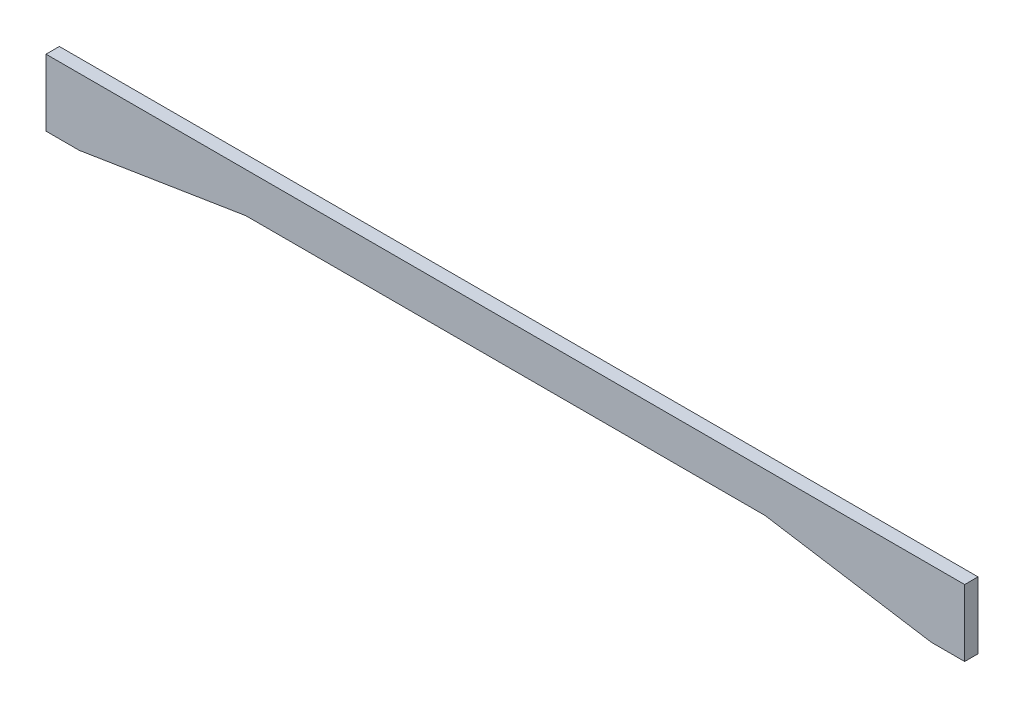
ISO-10303-21;
HEADER;
FILE_DESCRIPTION(('STEP AP214'),'2;1');
FILE_NAME('part.step','',(''),(''),'','','');
FILE_SCHEMA(('AUTOMOTIVE_DESIGN { 1 0 10303 214 1 1 1 1 }'));
ENDSEC;
DATA;
#1=APPLICATION_CONTEXT('core data for automotive mechanical design processes');
#2=APPLICATION_PROTOCOL_DEFINITION('international standard','automotive_design',2000,#1);
#3=PRODUCT_CONTEXT('',#1,'mechanical');
#4=PRODUCT('Part','Part','',(#3));
#5=PRODUCT_RELATED_PRODUCT_CATEGORY('part','',(#4));
#6=PRODUCT_DEFINITION_FORMATION('','',#4);
#7=PRODUCT_DEFINITION_CONTEXT('part definition',#1,'design');
#8=PRODUCT_DEFINITION('design','',#6,#7);
#9=PRODUCT_DEFINITION_SHAPE('','',#8);
#10=(LENGTH_UNIT() NAMED_UNIT(*) SI_UNIT(.MILLI.,.METRE.));
#11=(NAMED_UNIT(*) PLANE_ANGLE_UNIT() SI_UNIT($,.RADIAN.));
#12=(NAMED_UNIT(*) SI_UNIT($,.STERADIAN.) SOLID_ANGLE_UNIT());
#13=UNCERTAINTY_MEASURE_WITH_UNIT(LENGTH_MEASURE(1.E-05),#10,'distance_accuracy_value','');
#14=(GEOMETRIC_REPRESENTATION_CONTEXT(3) GLOBAL_UNCERTAINTY_ASSIGNED_CONTEXT((#13)) GLOBAL_UNIT_ASSIGNED_CONTEXT((#10,
#11,#12)) REPRESENTATION_CONTEXT('',''));
#15=CARTESIAN_POINT('',(0.,0.,0.));
#16=DIRECTION('',(0.,0.,1.));
#17=DIRECTION('',(1.,0.,0.));
#18=AXIS2_PLACEMENT_3D('',#15,#16,#17);
#19=CARTESIAN_POINT('',(0.,-8.,4.));
#20=DIRECTION('',(0.,1.,0.));
#21=DIRECTION('',(0.,0.,1.));
#22=AXIS2_PLACEMENT_3D('',#19,#20,#21);
#23=PLANE('',#22);
#24=DIRECTION('',(1.,0.,0.));
#25=VECTOR('',#24,1.);
#26=CARTESIAN_POINT('',(0.,-8.,0.));
#27=LINE('',#26,#25);
#28=CARTESIAN_POINT('',(-137.75,-8.,0.));
#29=VERTEX_POINT('',#28);
#30=CARTESIAN_POINT('',(-127.75,-8.,0.));
#31=VERTEX_POINT('',#30);
#32=EDGE_CURVE('E116',#29,#31,#27,.T.);
#33=ORIENTED_EDGE('',*,*,#32,.T.);
#34=DIRECTION('',(0.,0.,-1.));
#35=VECTOR('',#34,1.);
#36=CARTESIAN_POINT('',(-127.75,-8.,4.));
#37=LINE('',#36,#35);
#38=CARTESIAN_POINT('',(-127.75,-8.,4.));
#39=VERTEX_POINT('',#38);
#40=EDGE_CURVE('E11',#39,#31,#37,.T.);
#41=ORIENTED_EDGE('',*,*,#40,.F.);
#42=DIRECTION('',(1.,0.,0.));
#43=VECTOR('',#42,1.);
#44=CARTESIAN_POINT('',(0.,-8.,4.));
#45=LINE('',#44,#43);
#46=CARTESIAN_POINT('',(-137.75,-8.,4.));
#47=VERTEX_POINT('',#46);
#48=EDGE_CURVE('E145',#47,#39,#45,.T.);
#49=ORIENTED_EDGE('',*,*,#48,.F.);
#50=DIRECTION('',(0.,0.,-1.));
#51=VECTOR('',#50,1.);
#52=CARTESIAN_POINT('',(-137.75,-8.,4.));
#53=LINE('',#52,#51);
#54=EDGE_CURVE('E51',#47,#29,#53,.T.);
#55=ORIENTED_EDGE('',*,*,#54,.T.);
#56=EDGE_LOOP('',(#33,#41,#49,#55));
#57=FACE_BOUND('',#56,.T.);
#58=ADVANCED_FACE('F35',(#57),#23,.F.);
#59=CARTESIAN_POINT('',(-1.95103976814719,12.1690684395828,4.));
#60=DIRECTION('',(-0.158306064425804,0.98739009006877,0.));
#61=DIRECTION('',(-0.98739009006877,-0.158306064425804,0.));
#62=AXIS2_PLACEMENT_3D('',#59,#60,#61);
#63=PLANE('',#62);
#64=DIRECTION('',(0.98739009006877,0.158306064425804,0.));
#65=VECTOR('',#64,1.);
#66=CARTESIAN_POINT('',(-1.95103976814719,12.1690684395828,0.));
#67=LINE('',#66,#65);
#68=CARTESIAN_POINT('',(-77.8522228731333,0.,0.));
#69=VERTEX_POINT('',#68);
#70=EDGE_CURVE('E157',#31,#69,#67,.T.);
#71=ORIENTED_EDGE('',*,*,#70,.T.);
#72=DIRECTION('',(0.,0.,-1.));
#73=VECTOR('',#72,1.);
#74=CARTESIAN_POINT('',(-77.8522228731333,0.,4.));
#75=LINE('',#74,#73);
#76=CARTESIAN_POINT('',(-77.8522228731333,0.,4.));
#77=VERTEX_POINT('',#76);
#78=EDGE_CURVE('E43',#77,#69,#75,.T.);
#79=ORIENTED_EDGE('',*,*,#78,.F.);
#80=DIRECTION('',(0.98739009006877,0.158306064425804,0.));
#81=VECTOR('',#80,1.);
#82=CARTESIAN_POINT('',(-1.95103976814719,12.1690684395828,4.));
#83=LINE('',#82,#81);
#84=EDGE_CURVE('E77',#39,#77,#83,.T.);
#85=ORIENTED_EDGE('',*,*,#84,.F.);
#86=ORIENTED_EDGE('',*,*,#40,.T.);
#87=EDGE_LOOP('',(#71,#79,#85,#86));
#88=FACE_BOUND('',#87,.T.);
#89=ADVANCED_FACE('F171',(#88),#63,.F.);
#90=CARTESIAN_POINT('',(0.,0.,4.));
#91=DIRECTION('',(0.,-1.,0.));
#92=DIRECTION('',(0.,0.,-1.));
#93=AXIS2_PLACEMENT_3D('',#90,#91,#92);
#94=PLANE('',#93);
#95=DIRECTION('',(-1.,0.,0.));
#96=VECTOR('',#95,1.);
#97=CARTESIAN_POINT('',(0.,0.,0.));
#98=LINE('',#97,#96);
#99=CARTESIAN_POINT('',(77.8522228731333,0.,0.));
#100=VERTEX_POINT('',#99);
#101=EDGE_CURVE('E160',#100,#69,#98,.T.);
#102=ORIENTED_EDGE('',*,*,#101,.F.);
#103=DIRECTION('',(0.,0.,-1.));
#104=VECTOR('',#103,1.);
#105=CARTESIAN_POINT('',(77.8522228731333,0.,4.));
#106=LINE('',#105,#104);
#107=CARTESIAN_POINT('',(77.8522228731333,0.,4.));
#108=VERTEX_POINT('',#107);
#109=EDGE_CURVE('E141',#108,#100,#106,.T.);
#110=ORIENTED_EDGE('',*,*,#109,.F.);
#111=DIRECTION('',(-1.,0.,0.));
#112=VECTOR('',#111,1.);
#113=CARTESIAN_POINT('',(0.,0.,4.));
#114=LINE('',#113,#112);
#115=EDGE_CURVE('E149',#108,#77,#114,.T.);
#116=ORIENTED_EDGE('',*,*,#115,.T.);
#117=ORIENTED_EDGE('',*,*,#78,.T.);
#118=EDGE_LOOP('',(#102,#110,#116,#117));
#119=FACE_BOUND('',#118,.T.);
#120=ADVANCED_FACE('F169',(#119),#94,.T.);
#121=CARTESIAN_POINT('',(0.,12.,4.));
#122=DIRECTION('',(0.,1.,0.));
#123=DIRECTION('',(0.,0.,1.));
#124=AXIS2_PLACEMENT_3D('',#121,#122,#123);
#125=PLANE('',#124);
#126=DIRECTION('',(1.,0.,0.));
#127=VECTOR('',#126,1.);
#128=CARTESIAN_POINT('',(0.,12.,0.));
#129=LINE('',#128,#127);
#130=CARTESIAN_POINT('',(-137.75,12.,0.));
#131=VERTEX_POINT('',#130);
#132=CARTESIAN_POINT('',(137.75,12.,0.));
#133=VERTEX_POINT('',#132);
#134=EDGE_CURVE('E163',#131,#133,#129,.T.);
#135=ORIENTED_EDGE('',*,*,#134,.F.);
#136=DIRECTION('',(0.,0.,-1.));
#137=VECTOR('',#136,1.);
#138=CARTESIAN_POINT('',(-137.75,12.,4.));
#139=LINE('',#138,#137);
#140=CARTESIAN_POINT('',(-137.75,12.,4.));
#141=VERTEX_POINT('',#140);
#142=EDGE_CURVE('E66',#141,#131,#139,.T.);
#143=ORIENTED_EDGE('',*,*,#142,.F.);
#144=DIRECTION('',(1.,0.,0.));
#145=VECTOR('',#144,1.);
#146=CARTESIAN_POINT('',(0.,12.,4.));
#147=LINE('',#146,#145);
#148=CARTESIAN_POINT('',(137.75,12.,4.));
#149=VERTEX_POINT('',#148);
#150=EDGE_CURVE('E152',#141,#149,#147,.T.);
#151=ORIENTED_EDGE('',*,*,#150,.T.);
#152=DIRECTION('',(0.,0.,-1.));
#153=VECTOR('',#152,1.);
#154=CARTESIAN_POINT('',(137.75,12.,4.));
#155=LINE('',#154,#153);
#156=EDGE_CURVE('E117',#149,#133,#155,.T.);
#157=ORIENTED_EDGE('',*,*,#156,.T.);
#158=EDGE_LOOP('',(#135,#143,#151,#157));
#159=FACE_BOUND('',#158,.T.);
#160=ADVANCED_FACE('F190',(#159),#125,.T.);
#161=CARTESIAN_POINT('',(-137.75,0.,4.));
#162=DIRECTION('',(-1.,0.,0.));
#163=DIRECTION('',(0.,0.,1.));
#164=AXIS2_PLACEMENT_3D('',#161,#162,#163);
#165=PLANE('',#164);
#166=DIRECTION('',(0.,1.,0.));
#167=VECTOR('',#166,1.);
#168=CARTESIAN_POINT('',(-137.75,0.,0.));
#169=LINE('',#168,#167);
#170=EDGE_CURVE('E147',#29,#131,#169,.T.);
#171=ORIENTED_EDGE('',*,*,#170,.F.);
#172=ORIENTED_EDGE('',*,*,#54,.F.);
#173=DIRECTION('',(0.,1.,0.));
#174=VECTOR('',#173,1.);
#175=CARTESIAN_POINT('',(-137.75,0.,4.));
#176=LINE('',#175,#174);
#177=EDGE_CURVE('E154',#47,#141,#176,.T.);
#178=ORIENTED_EDGE('',*,*,#177,.T.);
#179=ORIENTED_EDGE('',*,*,#142,.T.);
#180=EDGE_LOOP('',(#171,#172,#178,#179));
#181=FACE_BOUND('',#180,.T.);
#182=ADVANCED_FACE('F188',(#181),#165,.T.);
#183=CARTESIAN_POINT('',(0.,0.,4.));
#184=DIRECTION('',(0.,0.,1.));
#185=DIRECTION('',(1.,0.,0.));
#186=AXIS2_PLACEMENT_3D('',#183,#184,#185);
#187=PLANE('',#186);
#188=ORIENTED_EDGE('',*,*,#48,.T.);
#189=ORIENTED_EDGE('',*,*,#84,.T.);
#190=ORIENTED_EDGE('',*,*,#115,.F.);
#191=DIRECTION('',(-0.98739009006877,0.158306064425804,0.));
#192=VECTOR('',#191,1.);
#193=CARTESIAN_POINT('',(1.95103976814719,12.1690684395828,4.));
#194=LINE('',#193,#192);
#195=CARTESIAN_POINT('',(127.75,-7.99999999999999,4.));
#196=VERTEX_POINT('',#195);
#197=EDGE_CURVE('E126',#196,#108,#194,.T.);
#198=ORIENTED_EDGE('',*,*,#197,.F.);
#199=DIRECTION('',(-1.,0.,0.));
#200=VECTOR('',#199,1.);
#201=CARTESIAN_POINT('',(0.,-8.,4.));
#202=LINE('',#201,#200);
#203=CARTESIAN_POINT('',(137.75,-7.99999999999999,4.));
#204=VERTEX_POINT('',#203);
#205=EDGE_CURVE('E109',#204,#196,#202,.T.);
#206=ORIENTED_EDGE('',*,*,#205,.F.);
#207=DIRECTION('',(0.,1.,0.));
#208=VECTOR('',#207,1.);
#209=CARTESIAN_POINT('',(137.75,0.,4.));
#210=LINE('',#209,#208);
#211=EDGE_CURVE('E121',#204,#149,#210,.T.);
#212=ORIENTED_EDGE('',*,*,#211,.T.);
#213=ORIENTED_EDGE('',*,*,#150,.F.);
#214=ORIENTED_EDGE('',*,*,#177,.F.);
#215=EDGE_LOOP('',(#188,#189,#190,#198,#206,#212,#213,#214));
#216=FACE_BOUND('',#215,.T.);
#217=ADVANCED_FACE('F128',(#216),#187,.T.);
#218=CARTESIAN_POINT('',(0.,0.,0.));
#219=DIRECTION('',(0.,0.,1.));
#220=DIRECTION('',(1.,0.,0.));
#221=AXIS2_PLACEMENT_3D('',#218,#219,#220);
#222=PLANE('',#221);
#223=ORIENTED_EDGE('',*,*,#32,.F.);
#224=ORIENTED_EDGE('',*,*,#170,.T.);
#225=ORIENTED_EDGE('',*,*,#134,.T.);
#226=DIRECTION('',(0.,1.,0.));
#227=VECTOR('',#226,1.);
#228=CARTESIAN_POINT('',(137.75,0.,0.));
#229=LINE('',#228,#227);
#230=CARTESIAN_POINT('',(137.75,-7.99999999999999,0.));
#231=VERTEX_POINT('',#230);
#232=EDGE_CURVE('E133',#231,#133,#229,.T.);
#233=ORIENTED_EDGE('',*,*,#232,.F.);
#234=DIRECTION('',(-1.,0.,0.));
#235=VECTOR('',#234,1.);
#236=CARTESIAN_POINT('',(0.,-8.,0.));
#237=LINE('',#236,#235);
#238=CARTESIAN_POINT('',(127.75,-7.99999999999999,0.));
#239=VERTEX_POINT('',#238);
#240=EDGE_CURVE('E112',#231,#239,#237,.T.);
#241=ORIENTED_EDGE('',*,*,#240,.T.);
#242=DIRECTION('',(-0.98739009006877,0.158306064425804,0.));
#243=VECTOR('',#242,1.);
#244=CARTESIAN_POINT('',(1.95103976814719,12.1690684395828,0.));
#245=LINE('',#244,#243);
#246=EDGE_CURVE('E130',#239,#100,#245,.T.);
#247=ORIENTED_EDGE('',*,*,#246,.T.);
#248=ORIENTED_EDGE('',*,*,#101,.T.);
#249=ORIENTED_EDGE('',*,*,#70,.F.);
#250=EDGE_LOOP('',(#223,#224,#225,#233,#241,#247,#248,#249));
#251=FACE_BOUND('',#250,.T.);
#252=ADVANCED_FACE('F174',(#251),#222,.F.);
#253=CARTESIAN_POINT('',(0.,-8.,4.));
#254=DIRECTION('',(0.,-1.,0.));
#255=DIRECTION('',(1.,0.,0.));
#256=AXIS2_PLACEMENT_3D('',#253,#254,#255);
#257=PLANE('',#256);
#258=ORIENTED_EDGE('',*,*,#240,.F.);
#259=DIRECTION('',(0.,0.,-1.));
#260=VECTOR('',#259,1.);
#261=CARTESIAN_POINT('',(137.75,-7.99999999999999,4.));
#262=LINE('',#261,#260);
#263=EDGE_CURVE('E105',#204,#231,#262,.T.);
#264=ORIENTED_EDGE('',*,*,#263,.F.);
#265=ORIENTED_EDGE('',*,*,#205,.T.);
#266=DIRECTION('',(0.,0.,-1.));
#267=VECTOR('',#266,1.);
#268=CARTESIAN_POINT('',(127.75,-7.99999999999999,4.));
#269=LINE('',#268,#267);
#270=EDGE_CURVE('E137',#196,#239,#269,.T.);
#271=ORIENTED_EDGE('',*,*,#270,.T.);
#272=EDGE_LOOP('',(#258,#264,#265,#271));
#273=FACE_BOUND('',#272,.T.);
#274=ADVANCED_FACE('F107',(#273),#257,.T.);
#275=CARTESIAN_POINT('',(137.75,0.,4.));
#276=DIRECTION('',(-1.,0.,0.));
#277=DIRECTION('',(0.,-1.,0.));
#278=AXIS2_PLACEMENT_3D('',#275,#276,#277);
#279=PLANE('',#278);
#280=ORIENTED_EDGE('',*,*,#232,.T.);
#281=ORIENTED_EDGE('',*,*,#156,.F.);
#282=ORIENTED_EDGE('',*,*,#211,.F.);
#283=ORIENTED_EDGE('',*,*,#263,.T.);
#284=EDGE_LOOP('',(#280,#281,#282,#283));
#285=FACE_BOUND('',#284,.T.);
#286=ADVANCED_FACE('F122',(#285),#279,.F.);
#287=CARTESIAN_POINT('',(1.95103976814719,12.1690684395828,4.));
#288=DIRECTION('',(-0.158306064425804,-0.98739009006877,0.));
#289=DIRECTION('',(0.98739009006877,-0.158306064425804,0.));
#290=AXIS2_PLACEMENT_3D('',#287,#288,#289);
#291=PLANE('',#290);
#292=ORIENTED_EDGE('',*,*,#246,.F.);
#293=ORIENTED_EDGE('',*,*,#270,.F.);
#294=ORIENTED_EDGE('',*,*,#197,.T.);
#295=ORIENTED_EDGE('',*,*,#109,.T.);
#296=EDGE_LOOP('',(#292,#293,#294,#295));
#297=FACE_BOUND('',#296,.T.);
#298=ADVANCED_FACE('F177',(#297),#291,.T.);
#299=CLOSED_SHELL('',(#58,#89,#120,#160,#182,#217,#252,#274,#286,#298));
#300=MANIFOLD_SOLID_BREP('B2',#299);
#301=ADVANCED_BREP_SHAPE_REPRESENTATION('',(#18,#300),#14);
#302=SHAPE_DEFINITION_REPRESENTATION(#9,#301);
ENDSEC;
END-ISO-10303-21;
